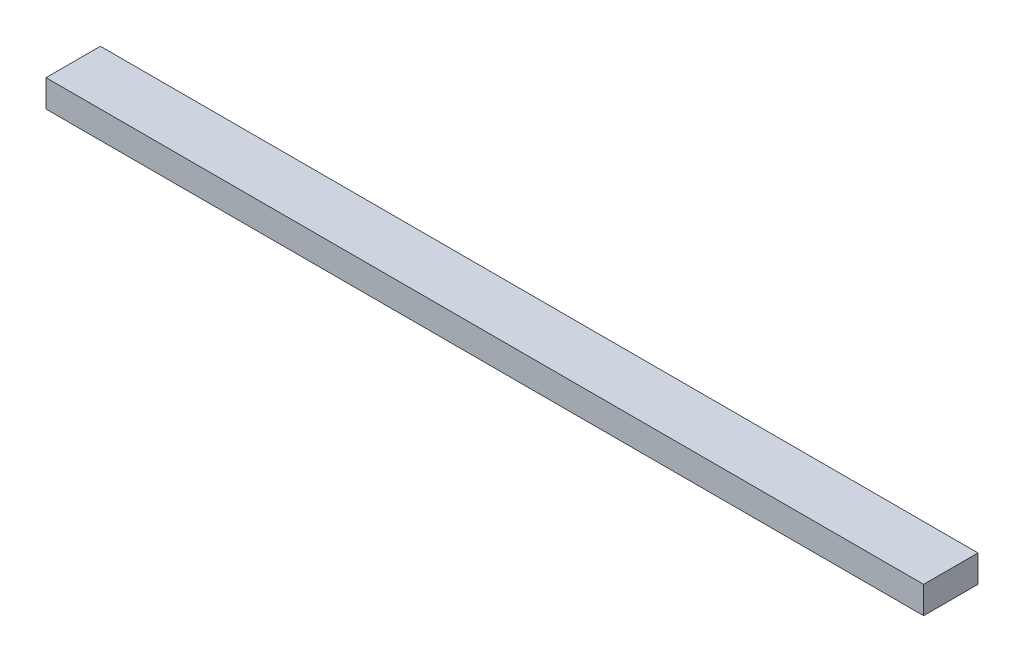
ISO-10303-21;
HEADER;
FILE_DESCRIPTION(('STEP AP214'),'2;1');
FILE_NAME('part.step','',(''),(''),'','','');
FILE_SCHEMA(('AUTOMOTIVE_DESIGN { 1 0 10303 214 1 1 1 1 }'));
ENDSEC;
DATA;
#1=APPLICATION_CONTEXT('core data for automotive mechanical design processes');
#2=APPLICATION_PROTOCOL_DEFINITION('international standard','automotive_design',2000,#1);
#3=PRODUCT_CONTEXT('',#1,'mechanical');
#4=PRODUCT('Part','Part','',(#3));
#5=PRODUCT_RELATED_PRODUCT_CATEGORY('part','',(#4));
#6=PRODUCT_DEFINITION_FORMATION('','',#4);
#7=PRODUCT_DEFINITION_CONTEXT('part definition',#1,'design');
#8=PRODUCT_DEFINITION('design','',#6,#7);
#9=PRODUCT_DEFINITION_SHAPE('','',#8);
#10=(LENGTH_UNIT() NAMED_UNIT(*) SI_UNIT(.MILLI.,.METRE.));
#11=(NAMED_UNIT(*) PLANE_ANGLE_UNIT() SI_UNIT($,.RADIAN.));
#12=(NAMED_UNIT(*) SI_UNIT($,.STERADIAN.) SOLID_ANGLE_UNIT());
#13=UNCERTAINTY_MEASURE_WITH_UNIT(LENGTH_MEASURE(1.E-05),#10,'distance_accuracy_value','');
#14=(GEOMETRIC_REPRESENTATION_CONTEXT(3) GLOBAL_UNCERTAINTY_ASSIGNED_CONTEXT((#13)) GLOBAL_UNIT_ASSIGNED_CONTEXT((#10,
#11,#12)) REPRESENTATION_CONTEXT('',''));
#15=CARTESIAN_POINT('',(0.,0.,0.));
#16=DIRECTION('',(0.,0.,1.));
#17=DIRECTION('',(1.,0.,0.));
#18=AXIS2_PLACEMENT_3D('',#15,#16,#17);
#19=CARTESIAN_POINT('',(-355.,-22.,44.));
#20=DIRECTION('',(-1.,0.,0.));
#21=DIRECTION('',(0.,0.,1.));
#22=AXIS2_PLACEMENT_3D('',#19,#20,#21);
#23=PLANE('',#22);
#24=DIRECTION('',(0.,1.,0.));
#25=VECTOR('',#24,1.);
#26=CARTESIAN_POINT('',(-355.,-22.,0.));
#27=LINE('',#26,#25);
#28=CARTESIAN_POINT('',(-355.,-22.,0.));
#29=VERTEX_POINT('',#28);
#30=CARTESIAN_POINT('',(-355.,0.,0.));
#31=VERTEX_POINT('',#30);
#32=EDGE_CURVE('E98',#29,#31,#27,.T.);
#33=ORIENTED_EDGE('',*,*,#32,.F.);
#34=DIRECTION('',(0.,0.,-1.));
#35=VECTOR('',#34,1.);
#36=CARTESIAN_POINT('',(-355.,-22.,44.));
#37=LINE('',#36,#35);
#38=CARTESIAN_POINT('',(-355.,-22.,44.));
#39=VERTEX_POINT('',#38);
#40=EDGE_CURVE('E11',#39,#29,#37,.T.);
#41=ORIENTED_EDGE('',*,*,#40,.F.);
#42=DIRECTION('',(0.,1.,0.));
#43=VECTOR('',#42,1.);
#44=CARTESIAN_POINT('',(-355.,-22.,44.));
#45=LINE('',#44,#43);
#46=CARTESIAN_POINT('',(-355.,0.,44.));
#47=VERTEX_POINT('',#46);
#48=EDGE_CURVE('E93',#39,#47,#45,.T.);
#49=ORIENTED_EDGE('',*,*,#48,.T.);
#50=DIRECTION('',(0.,0.,-1.));
#51=VECTOR('',#50,1.);
#52=CARTESIAN_POINT('',(-355.,0.,44.));
#53=LINE('',#52,#51);
#54=EDGE_CURVE('E36',#47,#31,#53,.T.);
#55=ORIENTED_EDGE('',*,*,#54,.T.);
#56=EDGE_LOOP('',(#33,#41,#49,#55));
#57=FACE_BOUND('',#56,.T.);
#58=ADVANCED_FACE('F33',(#57),#23,.T.);
#59=CARTESIAN_POINT('',(-355.,-22.,44.));
#60=DIRECTION('',(0.,1.,0.));
#61=DIRECTION('',(-1.,0.,0.));
#62=AXIS2_PLACEMENT_3D('',#59,#60,#61);
#63=PLANE('',#62);
#64=DIRECTION('',(1.,0.,0.));
#65=VECTOR('',#64,1.);
#66=CARTESIAN_POINT('',(-355.,-22.,0.));
#67=LINE('',#66,#65);
#68=CARTESIAN_POINT('',(355.,-22.,0.));
#69=VERTEX_POINT('',#68);
#70=EDGE_CURVE('E66',#29,#69,#67,.T.);
#71=ORIENTED_EDGE('',*,*,#70,.T.);
#72=DIRECTION('',(0.,0.,-1.));
#73=VECTOR('',#72,1.);
#74=CARTESIAN_POINT('',(355.,-22.,44.));
#75=LINE('',#74,#73);
#76=CARTESIAN_POINT('',(355.,-22.,44.));
#77=VERTEX_POINT('',#76);
#78=EDGE_CURVE('E42',#77,#69,#75,.T.);
#79=ORIENTED_EDGE('',*,*,#78,.F.);
#80=DIRECTION('',(1.,0.,0.));
#81=VECTOR('',#80,1.);
#82=CARTESIAN_POINT('',(-355.,-22.,44.));
#83=LINE('',#82,#81);
#84=EDGE_CURVE('E83',#39,#77,#83,.T.);
#85=ORIENTED_EDGE('',*,*,#84,.F.);
#86=ORIENTED_EDGE('',*,*,#40,.T.);
#87=EDGE_LOOP('',(#71,#79,#85,#86));
#88=FACE_BOUND('',#87,.T.);
#89=ADVANCED_FACE('F108',(#88),#63,.F.);
#90=CARTESIAN_POINT('',(355.,-22.,44.));
#91=DIRECTION('',(-1.,0.,0.));
#92=DIRECTION('',(0.,0.,1.));
#93=AXIS2_PLACEMENT_3D('',#90,#91,#92);
#94=PLANE('',#93);
#95=DIRECTION('',(0.,1.,0.));
#96=VECTOR('',#95,1.);
#97=CARTESIAN_POINT('',(355.,-22.,0.));
#98=LINE('',#97,#96);
#99=CARTESIAN_POINT('',(355.,0.,0.));
#100=VERTEX_POINT('',#99);
#101=EDGE_CURVE('E90',#69,#100,#98,.T.);
#102=ORIENTED_EDGE('',*,*,#101,.T.);
#103=DIRECTION('',(0.,0.,-1.));
#104=VECTOR('',#103,1.);
#105=CARTESIAN_POINT('',(355.,0.,44.));
#106=LINE('',#105,#104);
#107=CARTESIAN_POINT('',(355.,0.,44.));
#108=VERTEX_POINT('',#107);
#109=EDGE_CURVE('E87',#108,#100,#106,.T.);
#110=ORIENTED_EDGE('',*,*,#109,.F.);
#111=DIRECTION('',(0.,1.,0.));
#112=VECTOR('',#111,1.);
#113=CARTESIAN_POINT('',(355.,-22.,44.));
#114=LINE('',#113,#112);
#115=EDGE_CURVE('E78',#77,#108,#114,.T.);
#116=ORIENTED_EDGE('',*,*,#115,.F.);
#117=ORIENTED_EDGE('',*,*,#78,.T.);
#118=EDGE_LOOP('',(#102,#110,#116,#117));
#119=FACE_BOUND('',#118,.T.);
#120=ADVANCED_FACE('F88',(#119),#94,.F.);
#121=CARTESIAN_POINT('',(-355.,0.,44.));
#122=DIRECTION('',(0.,1.,0.));
#123=DIRECTION('',(0.,0.,1.));
#124=AXIS2_PLACEMENT_3D('',#121,#122,#123);
#125=PLANE('',#124);
#126=DIRECTION('',(1.,0.,0.));
#127=VECTOR('',#126,1.);
#128=CARTESIAN_POINT('',(-355.,0.,0.));
#129=LINE('',#128,#127);
#130=EDGE_CURVE('E101',#31,#100,#129,.T.);
#131=ORIENTED_EDGE('',*,*,#130,.F.);
#132=ORIENTED_EDGE('',*,*,#54,.F.);
#133=DIRECTION('',(1.,0.,0.));
#134=VECTOR('',#133,1.);
#135=CARTESIAN_POINT('',(-355.,0.,44.));
#136=LINE('',#135,#134);
#137=EDGE_CURVE('E82',#47,#108,#136,.T.);
#138=ORIENTED_EDGE('',*,*,#137,.T.);
#139=ORIENTED_EDGE('',*,*,#109,.T.);
#140=EDGE_LOOP('',(#131,#132,#138,#139));
#141=FACE_BOUND('',#140,.T.);
#142=ADVANCED_FACE('F92',(#141),#125,.T.);
#143=CARTESIAN_POINT('',(0.,0.,44.));
#144=DIRECTION('',(0.,0.,-1.));
#145=DIRECTION('',(-1.,0.,0.));
#146=AXIS2_PLACEMENT_3D('',#143,#144,#145);
#147=PLANE('',#146);
#148=ORIENTED_EDGE('',*,*,#48,.F.);
#149=ORIENTED_EDGE('',*,*,#84,.T.);
#150=ORIENTED_EDGE('',*,*,#115,.T.);
#151=ORIENTED_EDGE('',*,*,#137,.F.);
#152=EDGE_LOOP('',(#148,#149,#150,#151));
#153=FACE_BOUND('',#152,.T.);
#154=ADVANCED_FACE('F81',(#153),#147,.F.);
#155=CARTESIAN_POINT('',(0.,0.,0.));
#156=DIRECTION('',(0.,0.,-1.));
#157=DIRECTION('',(-1.,0.,0.));
#158=AXIS2_PLACEMENT_3D('',#155,#156,#157);
#159=PLANE('',#158);
#160=ORIENTED_EDGE('',*,*,#32,.T.);
#161=ORIENTED_EDGE('',*,*,#130,.T.);
#162=ORIENTED_EDGE('',*,*,#101,.F.);
#163=ORIENTED_EDGE('',*,*,#70,.F.);
#164=EDGE_LOOP('',(#160,#161,#162,#163));
#165=FACE_BOUND('',#164,.T.);
#166=ADVANCED_FACE('F106',(#165),#159,.T.);
#167=CLOSED_SHELL('',(#58,#89,#120,#142,#154,#166));
#168=MANIFOLD_SOLID_BREP('B2',#167);
#169=ADVANCED_BREP_SHAPE_REPRESENTATION('',(#18,#168),#14);
#170=SHAPE_DEFINITION_REPRESENTATION(#9,#169);
ENDSEC;
END-ISO-10303-21;
